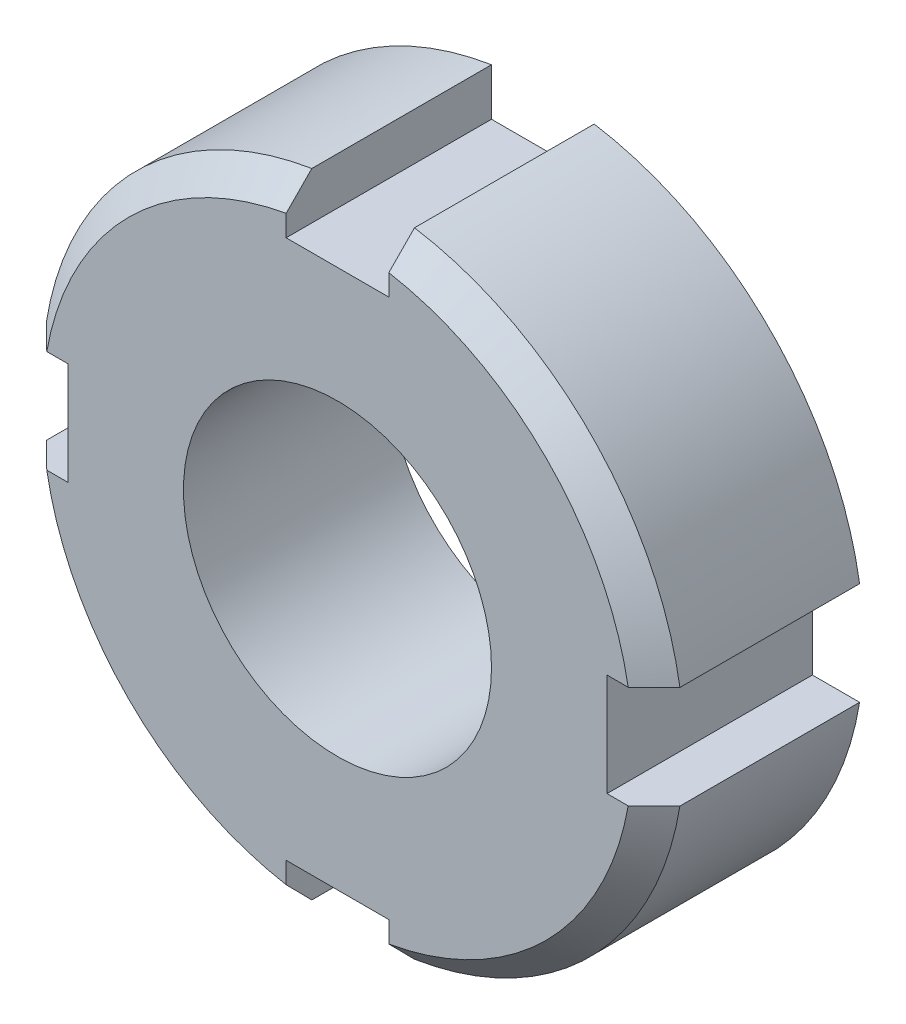
ISO-10303-21;
HEADER;
FILE_DESCRIPTION(('STEP AP214'),'2;1');
FILE_NAME('part.step','',(''),(''),'','','');
FILE_SCHEMA(('AUTOMOTIVE_DESIGN { 1 0 10303 214 1 1 1 1 }'));
ENDSEC;
DATA;
#1=APPLICATION_CONTEXT('core data for automotive mechanical design processes');
#2=APPLICATION_PROTOCOL_DEFINITION('international standard','automotive_design',2000,#1);
#3=PRODUCT_CONTEXT('',#1,'mechanical');
#4=PRODUCT('Part','Part','',(#3));
#5=PRODUCT_RELATED_PRODUCT_CATEGORY('part','',(#4));
#6=PRODUCT_DEFINITION_FORMATION('','',#4);
#7=PRODUCT_DEFINITION_CONTEXT('part definition',#1,'design');
#8=PRODUCT_DEFINITION('design','',#6,#7);
#9=PRODUCT_DEFINITION_SHAPE('','',#8);
#10=(LENGTH_UNIT() NAMED_UNIT(*) SI_UNIT(.MILLI.,.METRE.));
#11=(NAMED_UNIT(*) PLANE_ANGLE_UNIT() SI_UNIT($,.RADIAN.));
#12=(NAMED_UNIT(*) SI_UNIT($,.STERADIAN.) SOLID_ANGLE_UNIT());
#13=UNCERTAINTY_MEASURE_WITH_UNIT(LENGTH_MEASURE(1.E-05),#10,'distance_accuracy_value','');
#14=(GEOMETRIC_REPRESENTATION_CONTEXT(3) GLOBAL_UNCERTAINTY_ASSIGNED_CONTEXT((#13)) GLOBAL_UNIT_ASSIGNED_CONTEXT((#10,
#11,#12)) REPRESENTATION_CONTEXT('',''));
#15=CARTESIAN_POINT('',(0.,0.,0.));
#16=DIRECTION('',(0.,0.,1.));
#17=DIRECTION('',(1.,0.,0.));
#18=AXIS2_PLACEMENT_3D('',#15,#16,#17);
#19=CARTESIAN_POINT('',(0.,0.,8.));
#20=DIRECTION('',(0.,0.,-1.));
#21=DIRECTION('',(-1.,0.,0.));
#22=AXIS2_PLACEMENT_3D('',#19,#20,#21);
#23=CYLINDRICAL_SURFACE('',#22,12.5);
#24=DIRECTION('',(0.,0.,-1.));
#25=VECTOR('',#24,1.);
#26=CARTESIAN_POINT('',(2.,12.3389626792531,8.));
#27=LINE('',#26,#25);
#28=CARTESIAN_POINT('',(2.,12.3389626792531,0.));
#29=VERTEX_POINT('',#28);
#30=CARTESIAN_POINT('',(2.,12.3389626792531,7.));
#31=VERTEX_POINT('',#30);
#32=EDGE_CURVE('E199',#29,#31,#27,.F.);
#33=ORIENTED_EDGE('',*,*,#32,.T.);
#34=CARTESIAN_POINT('',(0.,0.,7.));
#35=DIRECTION('',(0.,0.,1.));
#36=DIRECTION('',(1.,0.,0.));
#37=AXIS2_PLACEMENT_3D('',#34,#35,#36);
#38=CIRCLE('',#37,12.5);
#39=CARTESIAN_POINT('',(12.3389626792531,1.99999999999996,7.));
#40=VERTEX_POINT('',#39);
#41=EDGE_CURVE('E447',#31,#40,#38,.F.);
#42=ORIENTED_EDGE('',*,*,#41,.T.);
#43=DIRECTION('',(0.,0.,-1.));
#44=VECTOR('',#43,1.);
#45=CARTESIAN_POINT('',(12.3389626792531,1.99999999999996,8.));
#46=LINE('',#45,#44);
#47=CARTESIAN_POINT('',(12.3389626792531,1.99999999999996,0.));
#48=VERTEX_POINT('',#47);
#49=EDGE_CURVE('E281',#40,#48,#46,.T.);
#50=ORIENTED_EDGE('',*,*,#49,.T.);
#51=CARTESIAN_POINT('',(0.,0.,0.));
#52=DIRECTION('',(0.,0.,1.));
#53=DIRECTION('',(1.,0.,0.));
#54=AXIS2_PLACEMENT_3D('',#51,#52,#53);
#55=CIRCLE('',#54,12.5);
#56=EDGE_CURVE('E296',#48,#29,#55,.T.);
#57=ORIENTED_EDGE('',*,*,#56,.T.);
#58=EDGE_LOOP('',(#33,#42,#50,#57));
#59=FACE_BOUND('',#58,.T.);
#60=ADVANCED_FACE('F39',(#59),#23,.T.);
#61=DIRECTION('',(0.,0.,-1.));
#62=VECTOR('',#61,1.);
#63=CARTESIAN_POINT('',(12.3389626792531,-2.00000000000004,8.));
#64=LINE('',#63,#62);
#65=CARTESIAN_POINT('',(12.3389626792531,-2.00000000000004,0.));
#66=VERTEX_POINT('',#65);
#67=CARTESIAN_POINT('',(12.3389626792531,-2.00000000000004,7.));
#68=VERTEX_POINT('',#67);
#69=EDGE_CURVE('E283',#66,#68,#64,.F.);
#70=ORIENTED_EDGE('',*,*,#69,.T.);
#71=CARTESIAN_POINT('',(0.,0.,7.));
#72=DIRECTION('',(0.,0.,1.));
#73=DIRECTION('',(1.,0.,0.));
#74=AXIS2_PLACEMENT_3D('',#71,#72,#73);
#75=CIRCLE('',#74,12.5);
#76=CARTESIAN_POINT('',(1.99999999999991,-12.3389626792531,7.));
#77=VERTEX_POINT('',#76);
#78=EDGE_CURVE('E368',#68,#77,#75,.F.);
#79=ORIENTED_EDGE('',*,*,#78,.T.);
#80=DIRECTION('',(0.,0.,-1.));
#81=VECTOR('',#80,1.);
#82=CARTESIAN_POINT('',(1.99999999999991,-12.3389626792531,8.));
#83=LINE('',#82,#81);
#84=CARTESIAN_POINT('',(1.99999999999991,-12.3389626792531,0.));
#85=VERTEX_POINT('',#84);
#86=EDGE_CURVE('E276',#77,#85,#83,.T.);
#87=ORIENTED_EDGE('',*,*,#86,.T.);
#88=EDGE_CURVE('E293',#85,#66,#55,.T.);
#89=ORIENTED_EDGE('',*,*,#88,.T.);
#90=EDGE_LOOP('',(#70,#79,#87,#89));
#91=FACE_BOUND('',#90,.T.);
#92=ADVANCED_FACE('F413',(#91),#23,.T.);
#93=DIRECTION('',(0.,0.,-1.));
#94=VECTOR('',#93,1.);
#95=CARTESIAN_POINT('',(-2.00000000000009,-12.3389626792531,8.));
#96=LINE('',#95,#94);
#97=CARTESIAN_POINT('',(-2.00000000000009,-12.3389626792531,0.));
#98=VERTEX_POINT('',#97);
#99=CARTESIAN_POINT('',(-2.00000000000009,-12.3389626792531,7.));
#100=VERTEX_POINT('',#99);
#101=EDGE_CURVE('E278',#98,#100,#96,.F.);
#102=ORIENTED_EDGE('',*,*,#101,.T.);
#103=CARTESIAN_POINT('',(0.,0.,7.));
#104=DIRECTION('',(0.,0.,1.));
#105=DIRECTION('',(1.,0.,0.));
#106=AXIS2_PLACEMENT_3D('',#103,#104,#105);
#107=CIRCLE('',#106,12.5);
#108=CARTESIAN_POINT('',(-12.3389626792531,-1.99999999999987,7.));
#109=VERTEX_POINT('',#108);
#110=EDGE_CURVE('E329',#100,#109,#107,.F.);
#111=ORIENTED_EDGE('',*,*,#110,.T.);
#112=DIRECTION('',(0.,0.,-1.));
#113=VECTOR('',#112,1.);
#114=CARTESIAN_POINT('',(-12.3389626792531,-1.99999999999987,8.));
#115=LINE('',#114,#113);
#116=CARTESIAN_POINT('',(-12.3389626792531,-1.99999999999987,0.));
#117=VERTEX_POINT('',#116);
#118=EDGE_CURVE('E192',#109,#117,#115,.T.);
#119=ORIENTED_EDGE('',*,*,#118,.T.);
#120=EDGE_CURVE('E466',#117,#98,#55,.T.);
#121=ORIENTED_EDGE('',*,*,#120,.T.);
#122=EDGE_LOOP('',(#102,#111,#119,#121));
#123=FACE_BOUND('',#122,.T.);
#124=ADVANCED_FACE('F419',(#123),#23,.T.);
#125=DIRECTION('',(0.,0.,-1.));
#126=VECTOR('',#125,1.);
#127=CARTESIAN_POINT('',(-12.338962679253,2.00000000000013,8.));
#128=LINE('',#127,#126);
#129=CARTESIAN_POINT('',(-12.338962679253,2.00000000000013,0.));
#130=VERTEX_POINT('',#129);
#131=CARTESIAN_POINT('',(-12.338962679253,2.00000000000013,6.99999999999999));
#132=VERTEX_POINT('',#131);
#133=EDGE_CURVE('E274',#130,#132,#128,.F.);
#134=ORIENTED_EDGE('',*,*,#133,.T.);
#135=CARTESIAN_POINT('',(0.,0.,6.99999999999999));
#136=DIRECTION('',(0.,0.,1.));
#137=DIRECTION('',(1.,0.,0.));
#138=AXIS2_PLACEMENT_3D('',#135,#136,#137);
#139=CIRCLE('',#138,12.5);
#140=CARTESIAN_POINT('',(-2.,12.3389626792531,6.99999999999999));
#141=VERTEX_POINT('',#140);
#142=EDGE_CURVE('E54',#132,#141,#139,.F.);
#143=ORIENTED_EDGE('',*,*,#142,.T.);
#144=DIRECTION('',(0.,0.,-1.));
#145=VECTOR('',#144,1.);
#146=CARTESIAN_POINT('',(-2.,12.3389626792531,8.));
#147=LINE('',#146,#145);
#148=CARTESIAN_POINT('',(-2.,12.3389626792531,0.));
#149=VERTEX_POINT('',#148);
#150=EDGE_CURVE('E286',#141,#149,#147,.T.);
#151=ORIENTED_EDGE('',*,*,#150,.T.);
#152=EDGE_CURVE('E299',#149,#130,#55,.T.);
#153=ORIENTED_EDGE('',*,*,#152,.T.);
#154=EDGE_LOOP('',(#134,#143,#151,#153));
#155=FACE_BOUND('',#154,.T.);
#156=ADVANCED_FACE('F415',(#155),#23,.T.);
#157=CARTESIAN_POINT('',(0.,0.,8.));
#158=DIRECTION('',(0.,0.,1.));
#159=DIRECTION('',(1.,0.,0.));
#160=AXIS2_PLACEMENT_3D('',#157,#158,#159);
#161=PLANE('',#160);
#162=DIRECTION('',(1.,0.,0.));
#163=VECTOR('',#162,1.);
#164=CARTESIAN_POINT('',(-10.5,-1.99999999999989,8.));
#165=LINE('',#164,#163);
#166=CARTESIAN_POINT('',(-11.3247516529061,-1.99999999999988,8.));
#167=VERTEX_POINT('',#166);
#168=CARTESIAN_POINT('',(-10.5,-1.99999999999989,8.));
#169=VERTEX_POINT('',#168);
#170=EDGE_CURVE('E264',#167,#169,#165,.T.);
#171=ORIENTED_EDGE('',*,*,#170,.F.);
#172=CARTESIAN_POINT('',(0.,0.,8.));
#173=DIRECTION('',(0.,0.,1.));
#174=DIRECTION('',(1.,0.,0.));
#175=AXIS2_PLACEMENT_3D('',#172,#173,#174);
#176=CIRCLE('',#175,11.5);
#177=CARTESIAN_POINT('',(-2.00000000000008,-11.3247516529061,8.));
#178=VERTEX_POINT('',#177);
#179=EDGE_CURVE('E318',#167,#178,#176,.T.);
#180=ORIENTED_EDGE('',*,*,#179,.T.);
#181=DIRECTION('',(0.,-1.,0.));
#182=VECTOR('',#181,1.);
#183=CARTESIAN_POINT('',(-2.00000000000007,-10.5,8.));
#184=LINE('',#183,#182);
#185=CARTESIAN_POINT('',(-2.00000000000007,-10.5,8.));
#186=VERTEX_POINT('',#185);
#187=EDGE_CURVE('E241',#186,#178,#184,.T.);
#188=ORIENTED_EDGE('',*,*,#187,.F.);
#189=DIRECTION('',(-1.,0.,0.));
#190=VECTOR('',#189,1.);
#191=CARTESIAN_POINT('',(1.99999999999993,-10.5,8.));
#192=LINE('',#191,#190);
#193=CARTESIAN_POINT('',(1.99999999999993,-10.5,8.));
#194=VERTEX_POINT('',#193);
#195=EDGE_CURVE('E247',#194,#186,#192,.T.);
#196=ORIENTED_EDGE('',*,*,#195,.F.);
#197=DIRECTION('',(0.,1.,0.));
#198=VECTOR('',#197,1.);
#199=CARTESIAN_POINT('',(1.99999999999993,-10.5,8.));
#200=LINE('',#199,#198);
#201=CARTESIAN_POINT('',(1.99999999999992,-11.3247516529061,8.));
#202=VERTEX_POINT('',#201);
#203=EDGE_CURVE('E245',#202,#194,#200,.T.);
#204=ORIENTED_EDGE('',*,*,#203,.F.);
#205=CARTESIAN_POINT('',(0.,0.,8.));
#206=DIRECTION('',(0.,0.,1.));
#207=DIRECTION('',(1.,0.,0.));
#208=AXIS2_PLACEMENT_3D('',#205,#206,#207);
#209=CIRCLE('',#208,11.5);
#210=CARTESIAN_POINT('',(11.3247516529061,-2.00000000000004,8.));
#211=VERTEX_POINT('',#210);
#212=EDGE_CURVE('E315',#202,#211,#209,.T.);
#213=ORIENTED_EDGE('',*,*,#212,.T.);
#214=DIRECTION('',(1.,0.,0.));
#215=VECTOR('',#214,1.);
#216=CARTESIAN_POINT('',(10.5,-2.00000000000004,8.));
#217=LINE('',#216,#215);
#218=CARTESIAN_POINT('',(10.5,-2.00000000000004,8.));
#219=VERTEX_POINT('',#218);
#220=EDGE_CURVE('E222',#219,#211,#217,.T.);
#221=ORIENTED_EDGE('',*,*,#220,.F.);
#222=DIRECTION('',(0.,-1.,0.));
#223=VECTOR('',#222,1.);
#224=CARTESIAN_POINT('',(10.5,1.99999999999996,8.));
#225=LINE('',#224,#223);
#226=CARTESIAN_POINT('',(10.5,1.99999999999996,8.));
#227=VERTEX_POINT('',#226);
#228=EDGE_CURVE('E228',#227,#219,#225,.T.);
#229=ORIENTED_EDGE('',*,*,#228,.F.);
#230=DIRECTION('',(-1.,0.,0.));
#231=VECTOR('',#230,1.);
#232=CARTESIAN_POINT('',(10.5,1.99999999999996,8.));
#233=LINE('',#232,#231);
#234=CARTESIAN_POINT('',(11.3247516529061,1.99999999999996,8.));
#235=VERTEX_POINT('',#234);
#236=EDGE_CURVE('E226',#235,#227,#233,.T.);
#237=ORIENTED_EDGE('',*,*,#236,.F.);
#238=CARTESIAN_POINT('',(0.,0.,8.));
#239=DIRECTION('',(0.,0.,1.));
#240=DIRECTION('',(1.,0.,0.));
#241=AXIS2_PLACEMENT_3D('',#238,#239,#240);
#242=CIRCLE('',#241,11.5);
#243=CARTESIAN_POINT('',(2.,11.3247516529061,8.));
#244=VERTEX_POINT('',#243);
#245=EDGE_CURVE('E312',#235,#244,#242,.T.);
#246=ORIENTED_EDGE('',*,*,#245,.T.);
#247=DIRECTION('',(0.,1.,0.));
#248=VECTOR('',#247,1.);
#249=CARTESIAN_POINT('',(2.,10.5,8.));
#250=LINE('',#249,#248);
#251=CARTESIAN_POINT('',(2.,10.5,8.));
#252=VERTEX_POINT('',#251);
#253=EDGE_CURVE('E212',#252,#244,#250,.T.);
#254=ORIENTED_EDGE('',*,*,#253,.F.);
#255=DIRECTION('',(1.,0.,0.));
#256=VECTOR('',#255,1.);
#257=CARTESIAN_POINT('',(-2.,10.5,8.));
#258=LINE('',#257,#256);
#259=CARTESIAN_POINT('',(-2.,10.5,8.));
#260=VERTEX_POINT('',#259);
#261=EDGE_CURVE('E188',#260,#252,#258,.T.);
#262=ORIENTED_EDGE('',*,*,#261,.F.);
#263=DIRECTION('',(0.,-1.,0.));
#264=VECTOR('',#263,1.);
#265=CARTESIAN_POINT('',(-2.,10.5,8.));
#266=LINE('',#265,#264);
#267=CARTESIAN_POINT('',(-2.,11.3247516529061,8.));
#268=VERTEX_POINT('',#267);
#269=EDGE_CURVE('E214',#268,#260,#266,.T.);
#270=ORIENTED_EDGE('',*,*,#269,.F.);
#271=CARTESIAN_POINT('',(0.,0.,8.));
#272=DIRECTION('',(0.,0.,1.));
#273=DIRECTION('',(1.,0.,0.));
#274=AXIS2_PLACEMENT_3D('',#271,#272,#273);
#275=CIRCLE('',#274,11.5);
#276=CARTESIAN_POINT('',(-11.3247516529061,2.00000000000012,8.));
#277=VERTEX_POINT('',#276);
#278=EDGE_CURVE('E309',#268,#277,#275,.T.);
#279=ORIENTED_EDGE('',*,*,#278,.T.);
#280=DIRECTION('',(-1.,0.,0.));
#281=VECTOR('',#280,1.);
#282=CARTESIAN_POINT('',(-10.5,2.00000000000011,8.));
#283=LINE('',#282,#281);
#284=CARTESIAN_POINT('',(-10.5,2.00000000000011,8.));
#285=VERTEX_POINT('',#284);
#286=EDGE_CURVE('E260',#285,#277,#283,.T.);
#287=ORIENTED_EDGE('',*,*,#286,.F.);
#288=DIRECTION('',(0.,1.,0.));
#289=VECTOR('',#288,1.);
#290=CARTESIAN_POINT('',(-10.5,-1.99999999999989,8.));
#291=LINE('',#290,#289);
#292=EDGE_CURVE('E266',#169,#285,#291,.T.);
#293=ORIENTED_EDGE('',*,*,#292,.F.);
#294=EDGE_LOOP('',(#171,#180,#188,#196,#204,#213,#221,#229,#237,#246,#254,#262,#270,#279,#287,#293));
#295=FACE_BOUND('',#294,.T.);
#296=CARTESIAN_POINT('',(0.,0.,8.));
#297=DIRECTION('',(0.,0.,1.));
#298=DIRECTION('',(1.,0.,0.));
#299=AXIS2_PLACEMENT_3D('',#296,#297,#298);
#300=CIRCLE('',#299,6.);
#301=CARTESIAN_POINT('',(6.,0.,8.));
#302=VERTEX_POINT('',#301);
#303=EDGE_CURVE('E289',#302,#302,#300,.T.);
#304=ORIENTED_EDGE('',*,*,#303,.F.);
#305=EDGE_LOOP('',(#304));
#306=FACE_BOUND('',#305,.T.);
#307=ADVANCED_FACE('F423',(#295,#306),#161,.T.);
#308=CARTESIAN_POINT('',(0.,0.,0.));
#309=DIRECTION('',(0.,0.,1.));
#310=DIRECTION('',(1.,0.,0.));
#311=AXIS2_PLACEMENT_3D('',#308,#309,#310);
#312=PLANE('',#311);
#313=CARTESIAN_POINT('',(0.,0.,0.));
#314=DIRECTION('',(0.,0.,1.));
#315=DIRECTION('',(1.,0.,0.));
#316=AXIS2_PLACEMENT_3D('',#313,#314,#315);
#317=CIRCLE('',#316,6.);
#318=CARTESIAN_POINT('',(6.,0.,0.));
#319=VERTEX_POINT('',#318);
#320=EDGE_CURVE('E290',#319,#319,#317,.T.);
#321=ORIENTED_EDGE('',*,*,#320,.T.);
#322=EDGE_LOOP('',(#321));
#323=FACE_BOUND('',#322,.T.);
#324=DIRECTION('',(1.,0.,0.));
#325=VECTOR('',#324,1.);
#326=CARTESIAN_POINT('',(-2.,10.5,0.));
#327=LINE('',#326,#325);
#328=CARTESIAN_POINT('',(-2.,10.5,0.));
#329=VERTEX_POINT('',#328);
#330=CARTESIAN_POINT('',(2.,10.5,0.));
#331=VERTEX_POINT('',#330);
#332=EDGE_CURVE('E185',#329,#331,#327,.T.);
#333=ORIENTED_EDGE('',*,*,#332,.T.);
#334=DIRECTION('',(0.,1.,0.));
#335=VECTOR('',#334,1.);
#336=CARTESIAN_POINT('',(2.,10.5,0.));
#337=LINE('',#336,#335);
#338=EDGE_CURVE('E196',#331,#29,#337,.T.);
#339=ORIENTED_EDGE('',*,*,#338,.T.);
#340=ORIENTED_EDGE('',*,*,#56,.F.);
#341=DIRECTION('',(-1.,0.,0.));
#342=VECTOR('',#341,1.);
#343=CARTESIAN_POINT('',(0.,2.,0.));
#344=LINE('',#343,#342);
#345=CARTESIAN_POINT('',(10.5,1.99999999999996,0.));
#346=VERTEX_POINT('',#345);
#347=EDGE_CURVE('E305',#48,#346,#344,.T.);
#348=ORIENTED_EDGE('',*,*,#347,.T.);
#349=DIRECTION('',(0.,-1.,0.));
#350=VECTOR('',#349,1.);
#351=CARTESIAN_POINT('',(10.5,1.99999999999996,0.));
#352=LINE('',#351,#350);
#353=CARTESIAN_POINT('',(10.5,-2.00000000000004,0.));
#354=VERTEX_POINT('',#353);
#355=EDGE_CURVE('E218',#346,#354,#352,.T.);
#356=ORIENTED_EDGE('',*,*,#355,.T.);
#357=DIRECTION('',(1.,0.,0.));
#358=VECTOR('',#357,1.);
#359=CARTESIAN_POINT('',(10.5,-2.00000000000004,0.));
#360=LINE('',#359,#358);
#361=EDGE_CURVE('E221',#354,#66,#360,.T.);
#362=ORIENTED_EDGE('',*,*,#361,.T.);
#363=ORIENTED_EDGE('',*,*,#88,.F.);
#364=DIRECTION('',(0.,1.,0.));
#365=VECTOR('',#364,1.);
#366=CARTESIAN_POINT('',(2.,0.,0.));
#367=LINE('',#366,#365);
#368=CARTESIAN_POINT('',(1.99999999999993,-10.5,0.));
#369=VERTEX_POINT('',#368);
#370=EDGE_CURVE('E302',#85,#369,#367,.T.);
#371=ORIENTED_EDGE('',*,*,#370,.T.);
#372=DIRECTION('',(-1.,0.,0.));
#373=VECTOR('',#372,1.);
#374=CARTESIAN_POINT('',(1.99999999999993,-10.5,0.));
#375=LINE('',#374,#373);
#376=CARTESIAN_POINT('',(-2.00000000000007,-10.5,0.));
#377=VERTEX_POINT('',#376);
#378=EDGE_CURVE('E237',#369,#377,#375,.T.);
#379=ORIENTED_EDGE('',*,*,#378,.T.);
#380=DIRECTION('',(0.,-1.,0.));
#381=VECTOR('',#380,1.);
#382=CARTESIAN_POINT('',(-2.00000000000007,-10.5,0.));
#383=LINE('',#382,#381);
#384=EDGE_CURVE('E240',#377,#98,#383,.T.);
#385=ORIENTED_EDGE('',*,*,#384,.T.);
#386=ORIENTED_EDGE('',*,*,#120,.F.);
#387=DIRECTION('',(1.,0.,0.));
#388=VECTOR('',#387,1.);
#389=CARTESIAN_POINT('',(0.,-2.,0.));
#390=LINE('',#389,#388);
#391=CARTESIAN_POINT('',(-10.5,-1.99999999999989,0.));
#392=VERTEX_POINT('',#391);
#393=EDGE_CURVE('E298',#117,#392,#390,.T.);
#394=ORIENTED_EDGE('',*,*,#393,.T.);
#395=DIRECTION('',(0.,1.,0.));
#396=VECTOR('',#395,1.);
#397=CARTESIAN_POINT('',(-10.5,-1.99999999999989,0.));
#398=LINE('',#397,#396);
#399=CARTESIAN_POINT('',(-10.5,2.00000000000011,0.));
#400=VERTEX_POINT('',#399);
#401=EDGE_CURVE('E256',#392,#400,#398,.T.);
#402=ORIENTED_EDGE('',*,*,#401,.T.);
#403=DIRECTION('',(-1.,0.,0.));
#404=VECTOR('',#403,1.);
#405=CARTESIAN_POINT('',(-10.5,2.00000000000011,0.));
#406=LINE('',#405,#404);
#407=EDGE_CURVE('E259',#400,#130,#406,.T.);
#408=ORIENTED_EDGE('',*,*,#407,.T.);
#409=ORIENTED_EDGE('',*,*,#152,.F.);
#410=DIRECTION('',(0.,-1.,0.));
#411=VECTOR('',#410,1.);
#412=CARTESIAN_POINT('',(-2.,0.,0.));
#413=LINE('',#412,#411);
#414=EDGE_CURVE('E208',#149,#329,#413,.T.);
#415=ORIENTED_EDGE('',*,*,#414,.T.);
#416=EDGE_LOOP('',(#333,#339,#340,#348,#356,#362,#363,#371,#379,#385,#386,#394,#402,#408,#409,#415));
#417=FACE_BOUND('',#416,.T.);
#418=ADVANCED_FACE('F205',(#323,#417),#312,.F.);
#419=CARTESIAN_POINT('',(0.,0.,0.));
#420=DIRECTION('',(0.,0.,1.));
#421=DIRECTION('',(1.,0.,0.));
#422=AXIS2_PLACEMENT_3D('',#419,#420,#421);
#423=CYLINDRICAL_SURFACE('',#422,6.);
#424=ORIENTED_EDGE('',*,*,#320,.F.);
#425=EDGE_LOOP('',(#424));
#426=FACE_BOUND('',#425,.T.);
#427=ORIENTED_EDGE('',*,*,#303,.T.);
#428=EDGE_LOOP('',(#427));
#429=FACE_BOUND('',#428,.T.);
#430=ADVANCED_FACE('F582',(#426,#429),#423,.F.);
#431=CARTESIAN_POINT('',(-10.5,2.00000000000011,0.));
#432=DIRECTION('',(0.,1.,0.));
#433=DIRECTION('',(-1.,0.,0.));
#434=AXIS2_PLACEMENT_3D('',#431,#432,#433);
#435=PLANE('',#434);
#436=ORIENTED_EDGE('',*,*,#286,.T.);
#437=CARTESIAN_POINT('',(-11.3247516529061,2.00000000000012,8.));
#438=CARTESIAN_POINT('',(-11.493886203623,2.00000000000012,7.83343412402712));
#439=CARTESIAN_POINT('',(-11.6629710648232,2.00000000000012,7.66681785239851));
#440=CARTESIAN_POINT('',(-12.0010414069381,2.00000000000013,7.33348451906443));
#441=CARTESIAN_POINT('',(-12.1700268878535,2.00000000000013,7.1667674573597));
#442=CARTESIAN_POINT('',(-12.338962679253,2.00000000000013,6.99999999999999));
#443=B_SPLINE_CURVE_WITH_KNOTS('',3,(#437,#438,#439,#440,#441,#442),.UNSPECIFIED.,.F.,.F.,(4,2,
4),(0.,0.712148896177296,1.42429778707947),.UNSPECIFIED.);
#444=EDGE_CURVE('E68',#277,#132,#443,.T.);
#445=ORIENTED_EDGE('',*,*,#444,.T.);
#446=ORIENTED_EDGE('',*,*,#133,.F.);
#447=ORIENTED_EDGE('',*,*,#407,.F.);
#448=DIRECTION('',(0.,0.,1.));
#449=VECTOR('',#448,1.);
#450=CARTESIAN_POINT('',(-10.5,2.00000000000011,0.));
#451=LINE('',#450,#449);
#452=EDGE_CURVE('E248',#400,#285,#451,.T.);
#453=ORIENTED_EDGE('',*,*,#452,.T.);
#454=EDGE_LOOP('',(#436,#445,#446,#447,#453));
#455=FACE_BOUND('',#454,.T.);
#456=ADVANCED_FACE('F356',(#455),#435,.F.);
#457=CARTESIAN_POINT('',(-10.5,-1.99999999999989,0.));
#458=DIRECTION('',(0.,-1.,0.));
#459=DIRECTION('',(1.,0.,0.));
#460=AXIS2_PLACEMENT_3D('',#457,#458,#459);
#461=PLANE('',#460);
#462=ORIENTED_EDGE('',*,*,#118,.F.);
#463=CARTESIAN_POINT('',(-12.3389626792531,-1.99999999999987,7.));
#464=CARTESIAN_POINT('',(-12.1700268878536,-1.99999999999987,7.1667674573597));
#465=CARTESIAN_POINT('',(-12.0010414069381,-1.99999999999987,7.33348451906444));
#466=CARTESIAN_POINT('',(-11.6629710648232,-1.99999999999988,7.66681785239852));
#467=CARTESIAN_POINT('',(-11.493886203623,-1.99999999999988,7.83343412402712));
#468=CARTESIAN_POINT('',(-11.3247516529061,-1.99999999999988,8.));
#469=B_SPLINE_CURVE_WITH_KNOTS('',3,(#463,#464,#465,#466,#467,#468),.UNSPECIFIED.,.F.,.F.,(4,2,
4),(0.,0.712148890902169,1.42429778707946),.UNSPECIFIED.);
#470=EDGE_CURVE('E393',#109,#167,#469,.T.);
#471=ORIENTED_EDGE('',*,*,#470,.T.);
#472=ORIENTED_EDGE('',*,*,#170,.T.);
#473=DIRECTION('',(0.,0.,1.));
#474=VECTOR('',#473,1.);
#475=CARTESIAN_POINT('',(-10.5,-1.99999999999989,0.));
#476=LINE('',#475,#474);
#477=EDGE_CURVE('E263',#392,#169,#476,.T.);
#478=ORIENTED_EDGE('',*,*,#477,.F.);
#479=ORIENTED_EDGE('',*,*,#393,.F.);
#480=EDGE_LOOP('',(#462,#471,#472,#478,#479));
#481=FACE_BOUND('',#480,.T.);
#482=ADVANCED_FACE('F482',(#481),#461,.F.);
#483=CARTESIAN_POINT('',(-10.5,-1.99999999999989,0.));
#484=DIRECTION('',(1.,0.,0.));
#485=DIRECTION('',(0.,1.,0.));
#486=AXIS2_PLACEMENT_3D('',#483,#484,#485);
#487=PLANE('',#486);
#488=ORIENTED_EDGE('',*,*,#292,.T.);
#489=ORIENTED_EDGE('',*,*,#452,.F.);
#490=ORIENTED_EDGE('',*,*,#401,.F.);
#491=ORIENTED_EDGE('',*,*,#477,.T.);
#492=EDGE_LOOP('',(#488,#489,#490,#491));
#493=FACE_BOUND('',#492,.T.);
#494=ADVANCED_FACE('F342',(#493),#487,.F.);
#495=CARTESIAN_POINT('',(-2.00000000000007,-10.5,0.));
#496=DIRECTION('',(-1.,0.,0.));
#497=DIRECTION('',(0.,-1.,0.));
#498=AXIS2_PLACEMENT_3D('',#495,#496,#497);
#499=PLANE('',#498);
#500=ORIENTED_EDGE('',*,*,#187,.T.);
#501=CARTESIAN_POINT('',(-2.00000000000008,-11.3247516529061,8.));
#502=CARTESIAN_POINT('',(-2.00000000000008,-11.493886203623,7.83343412402712));
#503=CARTESIAN_POINT('',(-2.00000000000008,-11.6629710648232,7.66681785239852));
#504=CARTESIAN_POINT('',(-2.00000000000008,-12.0010414069381,7.33348451906444));
#505=CARTESIAN_POINT('',(-2.00000000000009,-12.1700268878535,7.1667674573597));
#506=CARTESIAN_POINT('',(-2.00000000000009,-12.3389626792531,7.));
#507=B_SPLINE_CURVE_WITH_KNOTS('',3,(#501,#502,#503,#504,#505,#506),.UNSPECIFIED.,.F.,.F.,(4,2,
4),(0.,0.712148896177291,1.42429778707946),.UNSPECIFIED.);
#508=EDGE_CURVE('E321',#178,#100,#507,.T.);
#509=ORIENTED_EDGE('',*,*,#508,.T.);
#510=ORIENTED_EDGE('',*,*,#101,.F.);
#511=ORIENTED_EDGE('',*,*,#384,.F.);
#512=DIRECTION('',(0.,0.,1.));
#513=VECTOR('',#512,1.);
#514=CARTESIAN_POINT('',(-2.00000000000007,-10.5,0.));
#515=LINE('',#514,#513);
#516=EDGE_CURVE('E229',#377,#186,#515,.T.);
#517=ORIENTED_EDGE('',*,*,#516,.T.);
#518=EDGE_LOOP('',(#500,#509,#510,#511,#517));
#519=FACE_BOUND('',#518,.T.);
#520=ADVANCED_FACE('F336',(#519),#499,.F.);
#521=CARTESIAN_POINT('',(1.99999999999993,-10.5,0.));
#522=DIRECTION('',(1.,0.,0.));
#523=DIRECTION('',(0.,1.,0.));
#524=AXIS2_PLACEMENT_3D('',#521,#522,#523);
#525=PLANE('',#524);
#526=ORIENTED_EDGE('',*,*,#86,.F.);
#527=CARTESIAN_POINT('',(1.99999999999991,-12.3389626792531,7.));
#528=CARTESIAN_POINT('',(1.99999999999991,-12.1700268878536,7.1667674573597));
#529=CARTESIAN_POINT('',(1.99999999999992,-12.0010414069381,7.33348451906444));
#530=CARTESIAN_POINT('',(1.99999999999992,-11.6629710648232,7.66681785239852));
#531=CARTESIAN_POINT('',(1.99999999999992,-11.493886203623,7.83343412402712));
#532=CARTESIAN_POINT('',(1.99999999999992,-11.3247516529061,8.));
#533=B_SPLINE_CURVE_WITH_KNOTS('',3,(#527,#528,#529,#530,#531,#532),.UNSPECIFIED.,.F.,.F.,(4,2,
4),(0.,0.712148890902167,1.42429778707946),.UNSPECIFIED.);
#534=EDGE_CURVE('E360',#77,#202,#533,.T.);
#535=ORIENTED_EDGE('',*,*,#534,.T.);
#536=ORIENTED_EDGE('',*,*,#203,.T.);
#537=DIRECTION('',(0.,0.,1.));
#538=VECTOR('',#537,1.);
#539=CARTESIAN_POINT('',(1.99999999999993,-10.5,0.));
#540=LINE('',#539,#538);
#541=EDGE_CURVE('E244',#369,#194,#540,.T.);
#542=ORIENTED_EDGE('',*,*,#541,.F.);
#543=ORIENTED_EDGE('',*,*,#370,.F.);
#544=EDGE_LOOP('',(#526,#535,#536,#542,#543));
#545=FACE_BOUND('',#544,.T.);
#546=ADVANCED_FACE('F341',(#545),#525,.F.);
#547=CARTESIAN_POINT('',(1.99999999999993,-10.5,0.));
#548=DIRECTION('',(0.,1.,0.));
#549=DIRECTION('',(-1.,0.,0.));
#550=AXIS2_PLACEMENT_3D('',#547,#548,#549);
#551=PLANE('',#550);
#552=ORIENTED_EDGE('',*,*,#195,.T.);
#553=ORIENTED_EDGE('',*,*,#516,.F.);
#554=ORIENTED_EDGE('',*,*,#378,.F.);
#555=ORIENTED_EDGE('',*,*,#541,.T.);
#556=EDGE_LOOP('',(#552,#553,#554,#555));
#557=FACE_BOUND('',#556,.T.);
#558=ADVANCED_FACE('F347',(#557),#551,.F.);
#559=CARTESIAN_POINT('',(10.5,-2.00000000000004,0.));
#560=DIRECTION('',(0.,-1.,0.));
#561=DIRECTION('',(1.,0.,0.));
#562=AXIS2_PLACEMENT_3D('',#559,#560,#561);
#563=PLANE('',#562);
#564=ORIENTED_EDGE('',*,*,#220,.T.);
#565=CARTESIAN_POINT('',(11.3247516529061,-2.00000000000004,8.));
#566=CARTESIAN_POINT('',(11.493886203623,-2.00000000000004,7.83343412402712));
#567=CARTESIAN_POINT('',(11.6629710648232,-2.00000000000004,7.66681785239852));
#568=CARTESIAN_POINT('',(12.0010414069381,-2.00000000000004,7.33348451906444));
#569=CARTESIAN_POINT('',(12.1700268878536,-2.00000000000004,7.1667674573597));
#570=CARTESIAN_POINT('',(12.3389626792531,-2.00000000000004,7.));
#571=B_SPLINE_CURVE_WITH_KNOTS('',3,(#565,#566,#567,#568,#569,#570),.UNSPECIFIED.,.F.,.F.,(4,2,
4),(0.,0.712148896177288,1.42429778707945),.UNSPECIFIED.);
#572=EDGE_CURVE('E387',#211,#68,#571,.T.);
#573=ORIENTED_EDGE('',*,*,#572,.T.);
#574=ORIENTED_EDGE('',*,*,#69,.F.);
#575=ORIENTED_EDGE('',*,*,#361,.F.);
#576=DIRECTION('',(0.,0.,1.));
#577=VECTOR('',#576,1.);
#578=CARTESIAN_POINT('',(10.5,-2.00000000000004,0.));
#579=LINE('',#578,#577);
#580=EDGE_CURVE('E215',#354,#219,#579,.T.);
#581=ORIENTED_EDGE('',*,*,#580,.T.);
#582=EDGE_LOOP('',(#564,#573,#574,#575,#581));
#583=FACE_BOUND('',#582,.T.);
#584=ADVANCED_FACE('F350',(#583),#563,.F.);
#585=CARTESIAN_POINT('',(10.5,1.99999999999996,0.));
#586=DIRECTION('',(0.,1.,0.));
#587=DIRECTION('',(-1.,0.,0.));
#588=AXIS2_PLACEMENT_3D('',#585,#586,#587);
#589=PLANE('',#588);
#590=ORIENTED_EDGE('',*,*,#49,.F.);
#591=CARTESIAN_POINT('',(12.3389626792531,1.99999999999996,7.));
#592=CARTESIAN_POINT('',(12.1700268878536,1.99999999999996,7.1667674573597));
#593=CARTESIAN_POINT('',(12.0010414069381,1.99999999999996,7.33348451906444));
#594=CARTESIAN_POINT('',(11.6629710648232,1.99999999999996,7.66681785239852));
#595=CARTESIAN_POINT('',(11.493886203623,1.99999999999996,7.83343412402712));
#596=CARTESIAN_POINT('',(11.3247516529061,1.99999999999996,8.));
#597=B_SPLINE_CURVE_WITH_KNOTS('',3,(#591,#592,#593,#594,#595,#596),.UNSPECIFIED.,.F.,.F.,(4,2,
4),(0.,0.712148890902173,1.42429778707946),.UNSPECIFIED.);
#598=EDGE_CURVE('E436',#40,#235,#597,.T.);
#599=ORIENTED_EDGE('',*,*,#598,.T.);
#600=ORIENTED_EDGE('',*,*,#236,.T.);
#601=DIRECTION('',(0.,0.,1.));
#602=VECTOR('',#601,1.);
#603=CARTESIAN_POINT('',(10.5,1.99999999999996,0.));
#604=LINE('',#603,#602);
#605=EDGE_CURVE('E225',#346,#227,#604,.T.);
#606=ORIENTED_EDGE('',*,*,#605,.F.);
#607=ORIENTED_EDGE('',*,*,#347,.F.);
#608=EDGE_LOOP('',(#590,#599,#600,#606,#607));
#609=FACE_BOUND('',#608,.T.);
#610=ADVANCED_FACE('F344',(#609),#589,.F.);
#611=CARTESIAN_POINT('',(10.5,1.99999999999996,0.));
#612=DIRECTION('',(-1.,0.,0.));
#613=DIRECTION('',(0.,-1.,0.));
#614=AXIS2_PLACEMENT_3D('',#611,#612,#613);
#615=PLANE('',#614);
#616=ORIENTED_EDGE('',*,*,#228,.T.);
#617=ORIENTED_EDGE('',*,*,#580,.F.);
#618=ORIENTED_EDGE('',*,*,#355,.F.);
#619=ORIENTED_EDGE('',*,*,#605,.T.);
#620=EDGE_LOOP('',(#616,#617,#618,#619));
#621=FACE_BOUND('',#620,.T.);
#622=ADVANCED_FACE('F403',(#621),#615,.F.);
#623=CARTESIAN_POINT('',(2.,10.5,0.));
#624=DIRECTION('',(1.,0.,0.));
#625=DIRECTION('',(0.,0.,-1.));
#626=AXIS2_PLACEMENT_3D('',#623,#624,#625);
#627=PLANE('',#626);
#628=ORIENTED_EDGE('',*,*,#253,.T.);
#629=CARTESIAN_POINT('',(2.,11.3247516529061,8.));
#630=CARTESIAN_POINT('',(2.,11.493886203623,7.83343412402712));
#631=CARTESIAN_POINT('',(2.,11.6629710648232,7.66681785239852));
#632=CARTESIAN_POINT('',(2.,12.0010414069381,7.33348451906444));
#633=CARTESIAN_POINT('',(2.,12.1700268878536,7.1667674573597));
#634=CARTESIAN_POINT('',(2.,12.3389626792531,7.));
#635=B_SPLINE_CURVE_WITH_KNOTS('',3,(#629,#630,#631,#632,#633,#634),.UNSPECIFIED.,.F.,.F.,(4,2,
4),(0.,0.712148896177292,1.42429778707946),.UNSPECIFIED.);
#636=EDGE_CURVE('E367',#244,#31,#635,.T.);
#637=ORIENTED_EDGE('',*,*,#636,.T.);
#638=ORIENTED_EDGE('',*,*,#32,.F.);
#639=ORIENTED_EDGE('',*,*,#338,.F.);
#640=DIRECTION('',(0.,0.,1.));
#641=VECTOR('',#640,1.);
#642=CARTESIAN_POINT('',(2.,10.5,0.));
#643=LINE('',#642,#641);
#644=EDGE_CURVE('E180',#331,#252,#643,.T.);
#645=ORIENTED_EDGE('',*,*,#644,.T.);
#646=EDGE_LOOP('',(#628,#637,#638,#639,#645));
#647=FACE_BOUND('',#646,.T.);
#648=ADVANCED_FACE('F197',(#647),#627,.F.);
#649=CARTESIAN_POINT('',(-2.,10.5,0.));
#650=DIRECTION('',(-1.,0.,0.));
#651=DIRECTION('',(0.,0.,1.));
#652=AXIS2_PLACEMENT_3D('',#649,#650,#651);
#653=PLANE('',#652);
#654=ORIENTED_EDGE('',*,*,#150,.F.);
#655=CARTESIAN_POINT('',(-2.,12.3389626792531,6.99999999999999));
#656=CARTESIAN_POINT('',(-2.,12.1700268878536,7.1667674573597));
#657=CARTESIAN_POINT('',(-2.,12.0010414069381,7.33348451906443));
#658=CARTESIAN_POINT('',(-2.,11.6629710648232,7.66681785239851));
#659=CARTESIAN_POINT('',(-2.,11.493886203623,7.83343412402712));
#660=CARTESIAN_POINT('',(-2.,11.3247516529061,8.));
#661=B_SPLINE_CURVE_WITH_KNOTS('',3,(#655,#656,#657,#658,#659,#660),.UNSPECIFIED.,.F.,.F.,(4,2,
4),(0.,0.712148890902175,1.42429778707947),.UNSPECIFIED.);
#662=EDGE_CURVE('E11',#141,#268,#661,.T.);
#663=ORIENTED_EDGE('',*,*,#662,.T.);
#664=ORIENTED_EDGE('',*,*,#269,.T.);
#665=DIRECTION('',(0.,0.,1.));
#666=VECTOR('',#665,1.);
#667=CARTESIAN_POINT('',(-2.,10.5,0.));
#668=LINE('',#667,#666);
#669=EDGE_CURVE('E193',#329,#260,#668,.T.);
#670=ORIENTED_EDGE('',*,*,#669,.F.);
#671=ORIENTED_EDGE('',*,*,#414,.F.);
#672=EDGE_LOOP('',(#654,#663,#664,#670,#671));
#673=FACE_BOUND('',#672,.T.);
#674=ADVANCED_FACE('F410',(#673),#653,.F.);
#675=CARTESIAN_POINT('',(-2.,10.5,0.));
#676=DIRECTION('',(0.,-1.,0.));
#677=DIRECTION('',(0.,0.,-1.));
#678=AXIS2_PLACEMENT_3D('',#675,#676,#677);
#679=PLANE('',#678);
#680=ORIENTED_EDGE('',*,*,#261,.T.);
#681=ORIENTED_EDGE('',*,*,#644,.F.);
#682=ORIENTED_EDGE('',*,*,#332,.F.);
#683=ORIENTED_EDGE('',*,*,#669,.T.);
#684=EDGE_LOOP('',(#680,#681,#682,#683));
#685=FACE_BOUND('',#684,.T.);
#686=ADVANCED_FACE('F182',(#685),#679,.F.);
#687=CARTESIAN_POINT('',(0.,0.,8.));
#688=DIRECTION('',(0.,0.,-1.));
#689=DIRECTION('',(-1.,0.,0.));
#690=AXIS2_PLACEMENT_3D('',#687,#688,#689);
#691=CONICAL_SURFACE('',#690,11.5,0.785398163397448);
#692=ORIENTED_EDGE('',*,*,#470,.F.);
#693=ORIENTED_EDGE('',*,*,#110,.F.);
#694=ORIENTED_EDGE('',*,*,#508,.F.);
#695=ORIENTED_EDGE('',*,*,#179,.F.);
#696=EDGE_LOOP('',(#692,#693,#694,#695));
#697=FACE_BOUND('',#696,.T.);
#698=ADVANCED_FACE('F332',(#697),#691,.T.);
#699=CARTESIAN_POINT('',(0.,0.,8.));
#700=DIRECTION('',(0.,0.,-1.));
#701=DIRECTION('',(-1.,0.,0.));
#702=AXIS2_PLACEMENT_3D('',#699,#700,#701);
#703=CONICAL_SURFACE('',#702,11.5,0.785398163397446);
#704=ORIENTED_EDGE('',*,*,#534,.F.);
#705=ORIENTED_EDGE('',*,*,#78,.F.);
#706=ORIENTED_EDGE('',*,*,#572,.F.);
#707=ORIENTED_EDGE('',*,*,#212,.F.);
#708=EDGE_LOOP('',(#704,#705,#706,#707));
#709=FACE_BOUND('',#708,.T.);
#710=ADVANCED_FACE('F377',(#709),#703,.T.);
#711=CARTESIAN_POINT('',(0.,0.,8.));
#712=DIRECTION('',(0.,0.,-1.));
#713=DIRECTION('',(-1.,0.,0.));
#714=AXIS2_PLACEMENT_3D('',#711,#712,#713);
#715=CONICAL_SURFACE('',#714,11.5,0.78539816339745);
#716=ORIENTED_EDGE('',*,*,#598,.F.);
#717=ORIENTED_EDGE('',*,*,#41,.F.);
#718=ORIENTED_EDGE('',*,*,#636,.F.);
#719=ORIENTED_EDGE('',*,*,#245,.F.);
#720=EDGE_LOOP('',(#716,#717,#718,#719));
#721=FACE_BOUND('',#720,.T.);
#722=ADVANCED_FACE('F383',(#721),#715,.T.);
#723=CARTESIAN_POINT('',(0.,0.,8.));
#724=DIRECTION('',(0.,0.,-1.));
#725=DIRECTION('',(-1.,0.,0.));
#726=AXIS2_PLACEMENT_3D('',#723,#724,#725);
#727=CONICAL_SURFACE('',#726,11.5,0.785398163397447);
#728=ORIENTED_EDGE('',*,*,#662,.F.);
#729=ORIENTED_EDGE('',*,*,#142,.F.);
#730=ORIENTED_EDGE('',*,*,#444,.F.);
#731=ORIENTED_EDGE('',*,*,#278,.F.);
#732=EDGE_LOOP('',(#728,#729,#730,#731));
#733=FACE_BOUND('',#732,.T.);
#734=ADVANCED_FACE('F42',(#733),#727,.T.);
#735=CLOSED_SHELL('',(#60,#92,#124,#156,#307,#418,#430,#456,#482,#494,#520,#546,#558,#584,#610,
#622,#648,#674,#686,#698,#710,#722,#734));
#736=MANIFOLD_SOLID_BREP('B2',#735);
#737=ADVANCED_BREP_SHAPE_REPRESENTATION('',(#18,#736),#14);
#738=SHAPE_DEFINITION_REPRESENTATION(#9,#737);
ENDSEC;
END-ISO-10303-21;
